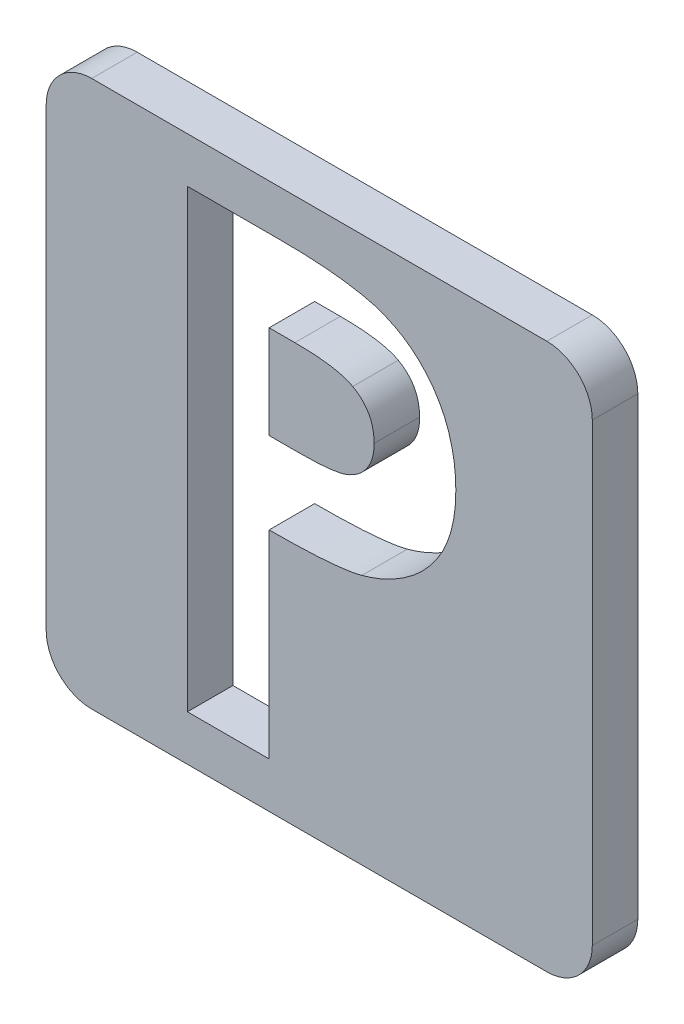
ISO-10303-21;
HEADER;
FILE_DESCRIPTION(('STEP AP214'),'2;1');
FILE_NAME('part.step','',(''),(''),'','','');
FILE_SCHEMA(('AUTOMOTIVE_DESIGN { 1 0 10303 214 1 1 1 1 }'));
ENDSEC;
DATA;
#1=APPLICATION_CONTEXT('core data for automotive mechanical design processes');
#2=APPLICATION_PROTOCOL_DEFINITION('international standard','automotive_design',2000,#1);
#3=PRODUCT_CONTEXT('',#1,'mechanical');
#4=PRODUCT('Part','Part','',(#3));
#5=PRODUCT_RELATED_PRODUCT_CATEGORY('part','',(#4));
#6=PRODUCT_DEFINITION_FORMATION('','',#4);
#7=PRODUCT_DEFINITION_CONTEXT('part definition',#1,'design');
#8=PRODUCT_DEFINITION('design','',#6,#7);
#9=PRODUCT_DEFINITION_SHAPE('','',#8);
#10=(LENGTH_UNIT() NAMED_UNIT(*) SI_UNIT(.MILLI.,.METRE.));
#11=(NAMED_UNIT(*) PLANE_ANGLE_UNIT() SI_UNIT($,.RADIAN.));
#12=(NAMED_UNIT(*) SI_UNIT($,.STERADIAN.) SOLID_ANGLE_UNIT());
#13=UNCERTAINTY_MEASURE_WITH_UNIT(LENGTH_MEASURE(1.E-05),#10,'distance_accuracy_value','');
#14=(GEOMETRIC_REPRESENTATION_CONTEXT(3) GLOBAL_UNCERTAINTY_ASSIGNED_CONTEXT((#13)) GLOBAL_UNIT_ASSIGNED_CONTEXT((#10,
#11,#12)) REPRESENTATION_CONTEXT('',''));
#15=CARTESIAN_POINT('',(0.,0.,0.));
#16=DIRECTION('',(0.,0.,1.));
#17=DIRECTION('',(1.,0.,0.));
#18=AXIS2_PLACEMENT_3D('',#15,#16,#17);
#19=CARTESIAN_POINT('',(50.,50.,10.));
#20=DIRECTION('',(0.,0.,-1.));
#21=DIRECTION('',(-1.,0.,0.));
#22=AXIS2_PLACEMENT_3D('',#19,#20,#21);
#23=PLANE('',#22);
#24=DIRECTION('',(1.,0.,0.));
#25=VECTOR('',#24,1.);
#26=CARTESIAN_POINT('',(-49.9999999999999,60.,10.));
#27=LINE('',#26,#25);
#28=CARTESIAN_POINT('',(-49.9999999999999,60.,10.));
#29=VERTEX_POINT('',#28);
#30=CARTESIAN_POINT('',(49.9999999999999,60.,10.));
#31=VERTEX_POINT('',#30);
#32=EDGE_CURVE('E297',#29,#31,#27,.T.);
#33=ORIENTED_EDGE('',*,*,#32,.F.);
#34=CARTESIAN_POINT('',(-50.,50.,10.));
#35=DIRECTION('',(0.,0.,1.));
#36=DIRECTION('',(1.,0.,0.));
#37=AXIS2_PLACEMENT_3D('',#34,#35,#36);
#38=CIRCLE('',#37,10.);
#39=CARTESIAN_POINT('',(-60.,49.9999999999999,10.));
#40=VERTEX_POINT('',#39);
#41=EDGE_CURVE('E303',#29,#40,#38,.T.);
#42=ORIENTED_EDGE('',*,*,#41,.T.);
#43=DIRECTION('',(0.,-1.,0.));
#44=VECTOR('',#43,1.);
#45=CARTESIAN_POINT('',(-60.,49.9999999999999,10.));
#46=LINE('',#45,#44);
#47=CARTESIAN_POINT('',(-60.,-49.9999999999999,10.));
#48=VERTEX_POINT('',#47);
#49=EDGE_CURVE('E305',#40,#48,#46,.T.);
#50=ORIENTED_EDGE('',*,*,#49,.T.);
#51=CARTESIAN_POINT('',(-50.,-50.,10.));
#52=DIRECTION('',(0.,0.,1.));
#53=DIRECTION('',(1.,0.,0.));
#54=AXIS2_PLACEMENT_3D('',#51,#52,#53);
#55=CIRCLE('',#54,10.);
#56=CARTESIAN_POINT('',(-49.9999999999999,-60.,10.));
#57=VERTEX_POINT('',#56);
#58=EDGE_CURVE('E307',#48,#57,#55,.T.);
#59=ORIENTED_EDGE('',*,*,#58,.T.);
#60=DIRECTION('',(1.,0.,0.));
#61=VECTOR('',#60,1.);
#62=CARTESIAN_POINT('',(-49.9999999999999,-60.,10.));
#63=LINE('',#62,#61);
#64=CARTESIAN_POINT('',(49.9999999999999,-60.,10.));
#65=VERTEX_POINT('',#64);
#66=EDGE_CURVE('E309',#57,#65,#63,.T.);
#67=ORIENTED_EDGE('',*,*,#66,.T.);
#68=CARTESIAN_POINT('',(50.,-50.,10.));
#69=DIRECTION('',(0.,0.,1.));
#70=DIRECTION('',(1.,0.,0.));
#71=AXIS2_PLACEMENT_3D('',#68,#69,#70);
#72=CIRCLE('',#71,10.);
#73=CARTESIAN_POINT('',(60.,-50.,10.));
#74=VERTEX_POINT('',#73);
#75=EDGE_CURVE('E191',#65,#74,#72,.T.);
#76=ORIENTED_EDGE('',*,*,#75,.T.);
#77=DIRECTION('',(0.,-1.,0.));
#78=VECTOR('',#77,1.);
#79=CARTESIAN_POINT('',(60.,49.9999999999999,10.));
#80=LINE('',#79,#78);
#81=CARTESIAN_POINT('',(60.,49.9999999999999,10.));
#82=VERTEX_POINT('',#81);
#83=EDGE_CURVE('E312',#82,#74,#80,.T.);
#84=ORIENTED_EDGE('',*,*,#83,.F.);
#85=CARTESIAN_POINT('',(50.,50.,10.));
#86=DIRECTION('',(0.,0.,-1.));
#87=DIRECTION('',(-1.,0.,0.));
#88=AXIS2_PLACEMENT_3D('',#85,#86,#87);
#89=CIRCLE('',#88,10.);
#90=EDGE_CURVE('E317',#31,#82,#89,.T.);
#91=ORIENTED_EDGE('',*,*,#90,.F.);
#92=EDGE_LOOP('',(#33,#42,#50,#59,#67,#76,#84,#91));
#93=FACE_BOUND('',#92,.T.);
#94=DIRECTION('',(0.,1.,0.));
#95=VECTOR('',#94,1.);
#96=CARTESIAN_POINT('',(-28.9615384615385,-50.,10.));
#97=LINE('',#96,#95);
#98=CARTESIAN_POINT('',(-28.9615384615385,-50.,10.));
#99=VERTEX_POINT('',#98);
#100=CARTESIAN_POINT('',(-28.9615384615385,50.,10.));
#101=VERTEX_POINT('',#100);
#102=EDGE_CURVE('E99',#99,#101,#97,.T.);
#103=ORIENTED_EDGE('',*,*,#102,.T.);
#104=DIRECTION('',(1.,0.,0.));
#105=VECTOR('',#104,1.);
#106=CARTESIAN_POINT('',(-28.9615384615385,50.,10.));
#107=LINE('',#106,#105);
#108=CARTESIAN_POINT('',(-8.92948717948718,50.,10.));
#109=VERTEX_POINT('',#108);
#110=EDGE_CURVE('E89',#101,#109,#107,.T.);
#111=ORIENTED_EDGE('',*,*,#110,.T.);
#112=CARTESIAN_POINT('',(-8.92948717948718,50.,10.));
#113=CARTESIAN_POINT('',(-7.62061893597607,49.994141227155,10.));
#114=CARTESIAN_POINT('',(-5.09553773840617,49.9828384262619,10.));
#115=CARTESIAN_POINT('',(-1.45416290408074,49.8457769305817,10.));
#116=CARTESIAN_POINT('',(1.90518367157898,49.6001543815466,10.));
#117=CARTESIAN_POINT('',(4.98173018478452,49.2966037548797,10.));
#118=CARTESIAN_POINT('',(7.77421163557631,48.8710375874276,10.));
#119=CARTESIAN_POINT('',(10.2861250487435,48.3831592970923,10.));
#120=CARTESIAN_POINT('',(12.5179917062721,47.7887815446204,10.));
#121=CARTESIAN_POINT('',(14.4949792225589,47.0832633905237,10.));
#122=CARTESIAN_POINT('',(16.2692616591532,46.25148505134,10.));
#123=CARTESIAN_POINT('',(17.9483051032826,45.3655817472497,10.));
#124=CARTESIAN_POINT('',(19.4941629875845,44.3082873988221,10.));
#125=CARTESIAN_POINT('',(20.9848594290215,43.1935527010039,10.));
#126=CARTESIAN_POINT('',(22.3351687414743,41.9148874759363,10.));
#127=CARTESIAN_POINT('',(23.6293313036927,40.5573887505258,10.));
#128=CARTESIAN_POINT('',(24.8125358012166,39.0672192413215,10.));
#129=CARTESIAN_POINT('',(25.8902647639301,37.4624170490553,10.));
#130=CARTESIAN_POINT('',(26.8679309986877,35.7726320564372,10.));
#131=CARTESIAN_POINT('',(27.7220856252221,33.9948434289309,10.));
#132=CARTESIAN_POINT('',(28.4149280250458,32.1262380020023,10.));
#133=CARTESIAN_POINT('',(28.9961366474227,30.1789035283388,10.));
#134=CARTESIAN_POINT('',(29.4629690750189,28.1529248770434,10.));
#135=CARTESIAN_POINT('',(29.7737075998739,26.0358420991668,10.));
#136=CARTESIAN_POINT('',(29.9847768383796,23.8424374709891,10.));
#137=CARTESIAN_POINT('',(30.0034007842426,22.349604897386,10.));
#138=CARTESIAN_POINT('',(30.0128205128205,21.5945512820513,10.));
#139=B_SPLINE_CURVE_WITH_KNOTS('',3,(#112,#113,#114,#115,#116,#117,#118,#119,#120,#121,#122,
#123,#124,#125,#126,#127,#128,#129,#130,#131,#132,#133,#134,#135,#136,#137,#138),.UNSPECIFIED.,
.F.,.F.,(4,1,1,1,1,1,1,1,1,1,1,1,1,1,1,1,1,1,1,1,1,1,1,1,4),(0.,0.0707811610050439,
0.136551696232278,0.197012482434324,0.252922694075429,0.303686532040096,0.349719151022807,
0.391240471277197,0.428478555486923,0.463056564891235,0.49715035762271,0.5310023337427,
0.564226376953418,0.597700669524039,0.631421420980903,0.665597346837222,0.7004514363039,
0.735880683980128,0.771092107926128,0.806974845023309,0.843534402844804,0.880940195544432,
0.919294384307275,0.959180240313535,1.),.UNSPECIFIED.);
#140=CARTESIAN_POINT('',(30.0128205128205,21.5945512820513,10.));
#141=VERTEX_POINT('',#140);
#142=EDGE_CURVE('E162',#109,#141,#139,.T.);
#143=ORIENTED_EDGE('',*,*,#142,.T.);
#144=CARTESIAN_POINT('',(30.0128205128205,21.5945512820513,10.));
#145=CARTESIAN_POINT('',(29.9991913449746,20.7592534454812,10.));
#146=CARTESIAN_POINT('',(29.97240835534,19.1177905512306,10.));
#147=CARTESIAN_POINT('',(29.70984874625,16.7116073318748,10.));
#148=CARTESIAN_POINT('',(29.2613139794813,14.4175294853795,10.));
#149=CARTESIAN_POINT('',(28.6751024998785,12.2162106419537,10.));
#150=CARTESIAN_POINT('',(27.8576722812855,10.1438673761004,10.));
#151=CARTESIAN_POINT('',(26.9237966421009,8.15105294155866,10.));
#152=CARTESIAN_POINT('',(25.7748333895482,6.29363973816612,10.));
#153=CARTESIAN_POINT('',(24.4619591939982,4.54839376386164,10.));
#154=CARTESIAN_POINT('',(23.0281507938461,2.90112534481889,10.));
#155=CARTESIAN_POINT('',(21.4393696389824,1.39939624186772,10.));
#156=CARTESIAN_POINT('',(19.7258985822293,0.0329692197277877,10.));
#157=CARTESIAN_POINT('',(17.8976562929788,-1.21247598401826,10.));
#158=CARTESIAN_POINT('',(15.9477790009029,-2.33442702891141,10.));
#159=CARTESIAN_POINT('',(13.8776736391486,-3.3433897944153,10.));
#160=CARTESIAN_POINT('',(11.6732043545179,-4.20709452257594,10.));
#161=CARTESIAN_POINT('',(10.1380782703469,-4.65880510164113,10.));
#162=CARTESIAN_POINT('',(9.35977564102564,-4.88782051282052,10.));
#163=B_SPLINE_CURVE_WITH_KNOTS('',3,(#144,#145,#146,#147,#148,#149,#150,#151,#152,#153,#154,
#155,#156,#157,#158,#159,#160,#161,#162),.UNSPECIFIED.,.F.,.F.,(4,1,1,1,1,1,1,1,1,1,1,1,1,1,1,1,
4),(0.,0.0688754254237469,0.135348674699122,0.19928931521934,0.261550080394498,
0.322915384153855,0.382771997126528,0.4428435721153,0.502652029102514,0.562748843189492,
0.622739581707681,0.682687331514855,0.743329246885999,0.805012514101275,0.868067120359293,
0.933110571061835,1.),.UNSPECIFIED.);
#164=CARTESIAN_POINT('',(9.35977564102564,-4.88782051282052,10.));
#165=VERTEX_POINT('',#164);
#166=EDGE_CURVE('E170',#141,#165,#163,.T.);
#167=ORIENTED_EDGE('',*,*,#166,.T.);
#168=CARTESIAN_POINT('',(9.35977564102564,-4.88782051282052,10.));
#169=CARTESIAN_POINT('',(8.84714075802548,-5.01536490144681,10.));
#170=CARTESIAN_POINT('',(7.73660852314056,-5.29166711896122,10.));
#171=CARTESIAN_POINT('',(5.89898269811195,-5.57218321927008,10.));
#172=CARTESIAN_POINT('',(3.78131187575789,-5.83010052573439,10.));
#173=CARTESIAN_POINT('',(1.37674824226034,-6.05174922698223,10.));
#174=CARTESIAN_POINT('',(-1.31609449117238,-6.20241869696783,10.));
#175=CARTESIAN_POINT('',(-4.29460894870648,-6.32008485221448,10.));
#176=CARTESIAN_POINT('',(-7.5601449459336,-6.40564029850087,10.));
#177=CARTESIAN_POINT('',(-9.83086954606305,-6.40867618134512,10.));
#178=CARTESIAN_POINT('',(-11.0128205128205,-6.41025641025642,10.));
#179=B_SPLINE_CURVE_WITH_KNOTS('',3,(#168,#169,#170,#171,#172,#173,#174,#175,#176,#177,#178),
.UNSPECIFIED.,.F.,.F.,(4,1,1,1,1,1,1,1,4),(0.,0.0773727494946835,0.167614290921154,
0.272108316519902,0.390015992275447,0.521363310208999,0.667272254031791,0.826809521070173,1.),.UNSPECIFIED.);
#180=CARTESIAN_POINT('',(-11.0128205128205,-6.41025641025642,10.));
#181=VERTEX_POINT('',#180);
#182=EDGE_CURVE('E177',#165,#181,#179,.T.);
#183=ORIENTED_EDGE('',*,*,#182,.T.);
#184=DIRECTION('',(0.,-1.,0.));
#185=VECTOR('',#184,1.);
#186=CARTESIAN_POINT('',(-11.0128205128205,-6.41025641025642,10.));
#187=LINE('',#186,#185);
#188=CARTESIAN_POINT('',(-11.0128205128205,-50.,10.));
#189=VERTEX_POINT('',#188);
#190=EDGE_CURVE('E326',#181,#189,#187,.T.);
#191=ORIENTED_EDGE('',*,*,#190,.T.);
#192=DIRECTION('',(-1.,0.,0.));
#193=VECTOR('',#192,1.);
#194=CARTESIAN_POINT('',(-11.0128205128205,-50.,10.));
#195=LINE('',#194,#193);
#196=EDGE_CURVE('E299',#189,#99,#195,.T.);
#197=ORIENTED_EDGE('',*,*,#196,.T.);
#198=EDGE_LOOP('',(#103,#111,#143,#167,#183,#191,#197));
#199=FACE_BOUND('',#198,.T.);
#200=ADVANCED_FACE('F43',(#93,#199),#23,.F.);
#201=CARTESIAN_POINT('',(50.,50.,0.));
#202=DIRECTION('',(0.,0.,-1.));
#203=DIRECTION('',(-1.,0.,0.));
#204=AXIS2_PLACEMENT_3D('',#201,#202,#203);
#205=PLANE('',#204);
#206=DIRECTION('',(1.,0.,0.));
#207=VECTOR('',#206,1.);
#208=CARTESIAN_POINT('',(-49.9999999999999,60.,0.));
#209=LINE('',#208,#207);
#210=CARTESIAN_POINT('',(-49.9999999999999,60.,0.));
#211=VERTEX_POINT('',#210);
#212=CARTESIAN_POINT('',(49.9999999999999,60.,0.));
#213=VERTEX_POINT('',#212);
#214=EDGE_CURVE('E240',#211,#213,#209,.T.);
#215=ORIENTED_EDGE('',*,*,#214,.T.);
#216=CARTESIAN_POINT('',(50.,50.,0.));
#217=DIRECTION('',(0.,0.,-1.));
#218=DIRECTION('',(-1.,0.,0.));
#219=AXIS2_PLACEMENT_3D('',#216,#217,#218);
#220=CIRCLE('',#219,10.);
#221=CARTESIAN_POINT('',(60.,49.9999999999999,0.));
#222=VERTEX_POINT('',#221);
#223=EDGE_CURVE('E288',#213,#222,#220,.T.);
#224=ORIENTED_EDGE('',*,*,#223,.T.);
#225=DIRECTION('',(0.,-1.,0.));
#226=VECTOR('',#225,1.);
#227=CARTESIAN_POINT('',(60.,49.9999999999999,0.));
#228=LINE('',#227,#226);
#229=CARTESIAN_POINT('',(60.,-50.,0.));
#230=VERTEX_POINT('',#229);
#231=EDGE_CURVE('E295',#222,#230,#228,.T.);
#232=ORIENTED_EDGE('',*,*,#231,.T.);
#233=CARTESIAN_POINT('',(50.,-50.,0.));
#234=DIRECTION('',(0.,0.,1.));
#235=DIRECTION('',(1.,0.,0.));
#236=AXIS2_PLACEMENT_3D('',#233,#234,#235);
#237=CIRCLE('',#236,10.);
#238=CARTESIAN_POINT('',(49.9999999999999,-60.,0.));
#239=VERTEX_POINT('',#238);
#240=EDGE_CURVE('E348',#239,#230,#237,.T.);
#241=ORIENTED_EDGE('',*,*,#240,.F.);
#242=DIRECTION('',(1.,0.,0.));
#243=VECTOR('',#242,1.);
#244=CARTESIAN_POINT('',(-49.9999999999999,-60.,0.));
#245=LINE('',#244,#243);
#246=CARTESIAN_POINT('',(-49.9999999999999,-60.,0.));
#247=VERTEX_POINT('',#246);
#248=EDGE_CURVE('E352',#247,#239,#245,.T.);
#249=ORIENTED_EDGE('',*,*,#248,.F.);
#250=CARTESIAN_POINT('',(-50.,-50.,0.));
#251=DIRECTION('',(0.,0.,1.));
#252=DIRECTION('',(1.,0.,0.));
#253=AXIS2_PLACEMENT_3D('',#250,#251,#252);
#254=CIRCLE('',#253,10.);
#255=CARTESIAN_POINT('',(-60.,-49.9999999999999,0.));
#256=VERTEX_POINT('',#255);
#257=EDGE_CURVE('E356',#256,#247,#254,.T.);
#258=ORIENTED_EDGE('',*,*,#257,.F.);
#259=DIRECTION('',(0.,-1.,0.));
#260=VECTOR('',#259,1.);
#261=CARTESIAN_POINT('',(-60.,49.9999999999999,0.));
#262=LINE('',#261,#260);
#263=CARTESIAN_POINT('',(-60.,49.9999999999999,0.));
#264=VERTEX_POINT('',#263);
#265=EDGE_CURVE('E360',#264,#256,#262,.T.);
#266=ORIENTED_EDGE('',*,*,#265,.F.);
#267=CARTESIAN_POINT('',(-50.,50.,0.));
#268=DIRECTION('',(0.,0.,1.));
#269=DIRECTION('',(1.,0.,0.));
#270=AXIS2_PLACEMENT_3D('',#267,#268,#269);
#271=CIRCLE('',#270,10.);
#272=EDGE_CURVE('E339',#211,#264,#271,.T.);
#273=ORIENTED_EDGE('',*,*,#272,.F.);
#274=EDGE_LOOP('',(#215,#224,#232,#241,#249,#258,#266,#273));
#275=FACE_BOUND('',#274,.T.);
#276=DIRECTION('',(1.,0.,0.));
#277=VECTOR('',#276,1.);
#278=CARTESIAN_POINT('',(-28.9615384615385,50.,0.));
#279=LINE('',#278,#277);
#280=CARTESIAN_POINT('',(-28.9615384615385,50.,0.));
#281=VERTEX_POINT('',#280);
#282=CARTESIAN_POINT('',(-8.92948717948718,50.,0.));
#283=VERTEX_POINT('',#282);
#284=EDGE_CURVE('E85',#281,#283,#279,.T.);
#285=ORIENTED_EDGE('',*,*,#284,.F.);
#286=DIRECTION('',(0.,1.,0.));
#287=VECTOR('',#286,1.);
#288=CARTESIAN_POINT('',(-28.9615384615385,-50.,0.));
#289=LINE('',#288,#287);
#290=CARTESIAN_POINT('',(-28.9615384615385,-50.,0.));
#291=VERTEX_POINT('',#290);
#292=EDGE_CURVE('E46',#291,#281,#289,.T.);
#293=ORIENTED_EDGE('',*,*,#292,.F.);
#294=DIRECTION('',(-1.,0.,0.));
#295=VECTOR('',#294,1.);
#296=CARTESIAN_POINT('',(-11.0128205128205,-50.,0.));
#297=LINE('',#296,#295);
#298=CARTESIAN_POINT('',(-11.0128205128205,-50.,0.));
#299=VERTEX_POINT('',#298);
#300=EDGE_CURVE('E52',#299,#291,#297,.T.);
#301=ORIENTED_EDGE('',*,*,#300,.F.);
#302=DIRECTION('',(0.,-1.,0.));
#303=VECTOR('',#302,1.);
#304=CARTESIAN_POINT('',(-11.0128205128205,-6.41025641025642,0.));
#305=LINE('',#304,#303);
#306=CARTESIAN_POINT('',(-11.0128205128205,-6.41025641025642,0.));
#307=VERTEX_POINT('',#306);
#308=EDGE_CURVE('E194',#307,#299,#305,.T.);
#309=ORIENTED_EDGE('',*,*,#308,.F.);
#310=CARTESIAN_POINT('',(9.35977564102564,-4.88782051282052,0.));
#311=CARTESIAN_POINT('',(8.84714075802548,-5.01536490144681,0.));
#312=CARTESIAN_POINT('',(7.73660852314056,-5.29166711896122,0.));
#313=CARTESIAN_POINT('',(5.89898269811195,-5.57218321927008,0.));
#314=CARTESIAN_POINT('',(3.78131187575789,-5.83010052573439,0.));
#315=CARTESIAN_POINT('',(1.37674824226034,-6.05174922698223,0.));
#316=CARTESIAN_POINT('',(-1.31609449117238,-6.20241869696783,0.));
#317=CARTESIAN_POINT('',(-4.29460894870648,-6.32008485221448,0.));
#318=CARTESIAN_POINT('',(-7.5601449459336,-6.40564029850087,0.));
#319=CARTESIAN_POINT('',(-9.83086954606305,-6.40867618134512,0.));
#320=CARTESIAN_POINT('',(-11.0128205128205,-6.41025641025642,0.));
#321=B_SPLINE_CURVE_WITH_KNOTS('',3,(#310,#311,#312,#313,#314,#315,#316,#317,#318,#319,#320),
.UNSPECIFIED.,.F.,.F.,(4,1,1,1,1,1,1,1,4),(0.,0.0773727494946835,0.167614290921154,
0.272108316519902,0.390015992275447,0.521363310208999,0.667272254031791,0.826809521070173,1.),.UNSPECIFIED.);
#322=CARTESIAN_POINT('',(9.35977564102564,-4.88782051282052,0.));
#323=VERTEX_POINT('',#322);
#324=EDGE_CURVE('E198',#323,#307,#321,.T.);
#325=ORIENTED_EDGE('',*,*,#324,.F.);
#326=CARTESIAN_POINT('',(30.0128205128205,21.5945512820513,0.));
#327=CARTESIAN_POINT('',(29.9991913449746,20.7592534454812,0.));
#328=CARTESIAN_POINT('',(29.97240835534,19.1177905512306,0.));
#329=CARTESIAN_POINT('',(29.70984874625,16.7116073318748,0.));
#330=CARTESIAN_POINT('',(29.2613139794813,14.4175294853795,0.));
#331=CARTESIAN_POINT('',(28.6751024998785,12.2162106419537,0.));
#332=CARTESIAN_POINT('',(27.8576722812855,10.1438673761004,0.));
#333=CARTESIAN_POINT('',(26.9237966421009,8.15105294155866,0.));
#334=CARTESIAN_POINT('',(25.7748333895482,6.29363973816612,0.));
#335=CARTESIAN_POINT('',(24.4619591939982,4.54839376386164,0.));
#336=CARTESIAN_POINT('',(23.0281507938461,2.90112534481889,0.));
#337=CARTESIAN_POINT('',(21.4393696389824,1.39939624186772,0.));
#338=CARTESIAN_POINT('',(19.7258985822293,0.0329692197277877,0.));
#339=CARTESIAN_POINT('',(17.8976562929788,-1.21247598401826,0.));
#340=CARTESIAN_POINT('',(15.9477790009029,-2.33442702891141,0.));
#341=CARTESIAN_POINT('',(13.8776736391486,-3.3433897944153,0.));
#342=CARTESIAN_POINT('',(11.6732043545179,-4.20709452257594,0.));
#343=CARTESIAN_POINT('',(10.1380782703469,-4.65880510164113,0.));
#344=CARTESIAN_POINT('',(9.35977564102564,-4.88782051282052,0.));
#345=B_SPLINE_CURVE_WITH_KNOTS('',3,(#326,#327,#328,#329,#330,#331,#332,#333,#334,#335,#336,
#337,#338,#339,#340,#341,#342,#343,#344),.UNSPECIFIED.,.F.,.F.,(4,1,1,1,1,1,1,1,1,1,1,1,1,1,1,1,
4),(0.,0.0688754254237469,0.135348674699122,0.19928931521934,0.261550080394498,
0.322915384153855,0.382771997126528,0.4428435721153,0.502652029102514,0.562748843189492,
0.622739581707681,0.682687331514855,0.743329246885999,0.805012514101275,0.868067120359293,
0.933110571061835,1.),.UNSPECIFIED.);
#346=CARTESIAN_POINT('',(30.0128205128205,21.5945512820513,0.));
#347=VERTEX_POINT('',#346);
#348=EDGE_CURVE('E167',#347,#323,#345,.T.);
#349=ORIENTED_EDGE('',*,*,#348,.F.);
#350=CARTESIAN_POINT('',(-8.92948717948718,50.,0.));
#351=CARTESIAN_POINT('',(-7.62061893597607,49.994141227155,0.));
#352=CARTESIAN_POINT('',(-5.09553773840617,49.9828384262619,0.));
#353=CARTESIAN_POINT('',(-1.45416290408074,49.8457769305817,0.));
#354=CARTESIAN_POINT('',(1.90518367157898,49.6001543815466,0.));
#355=CARTESIAN_POINT('',(4.98173018478452,49.2966037548797,0.));
#356=CARTESIAN_POINT('',(7.77421163557631,48.8710375874276,0.));
#357=CARTESIAN_POINT('',(10.2861250487435,48.3831592970923,0.));
#358=CARTESIAN_POINT('',(12.5179917062721,47.7887815446204,0.));
#359=CARTESIAN_POINT('',(14.4949792225589,47.0832633905237,0.));
#360=CARTESIAN_POINT('',(16.2692616591532,46.25148505134,0.));
#361=CARTESIAN_POINT('',(17.9483051032826,45.3655817472497,0.));
#362=CARTESIAN_POINT('',(19.4941629875845,44.3082873988221,0.));
#363=CARTESIAN_POINT('',(20.9848594290215,43.1935527010039,0.));
#364=CARTESIAN_POINT('',(22.3351687414743,41.9148874759363,0.));
#365=CARTESIAN_POINT('',(23.6293313036927,40.5573887505258,0.));
#366=CARTESIAN_POINT('',(24.8125358012166,39.0672192413215,0.));
#367=CARTESIAN_POINT('',(25.8902647639301,37.4624170490553,0.));
#368=CARTESIAN_POINT('',(26.8679309986877,35.7726320564372,0.));
#369=CARTESIAN_POINT('',(27.7220856252221,33.9948434289309,0.));
#370=CARTESIAN_POINT('',(28.4149280250458,32.1262380020023,0.));
#371=CARTESIAN_POINT('',(28.9961366474227,30.1789035283388,0.));
#372=CARTESIAN_POINT('',(29.4629690750189,28.1529248770434,0.));
#373=CARTESIAN_POINT('',(29.7737075998739,26.0358420991668,0.));
#374=CARTESIAN_POINT('',(29.9847768383796,23.8424374709891,0.));
#375=CARTESIAN_POINT('',(30.0034007842426,22.349604897386,0.));
#376=CARTESIAN_POINT('',(30.0128205128205,21.5945512820513,0.));
#377=B_SPLINE_CURVE_WITH_KNOTS('',3,(#350,#351,#352,#353,#354,#355,#356,#357,#358,#359,#360,
#361,#362,#363,#364,#365,#366,#367,#368,#369,#370,#371,#372,#373,#374,#375,#376),.UNSPECIFIED.,
.F.,.F.,(4,1,1,1,1,1,1,1,1,1,1,1,1,1,1,1,1,1,1,1,1,1,1,1,4),(0.,0.0707811610050439,
0.136551696232278,0.197012482434324,0.252922694075429,0.303686532040096,0.349719151022807,
0.391240471277197,0.428478555486923,0.463056564891235,0.49715035762271,0.5310023337427,
0.564226376953418,0.597700669524039,0.631421420980903,0.665597346837222,0.7004514363039,
0.735880683980128,0.771092107926128,0.806974845023309,0.843534402844804,0.880940195544432,
0.919294384307275,0.959180240313535,1.),.UNSPECIFIED.);
#378=EDGE_CURVE('E164',#283,#347,#377,.T.);
#379=ORIENTED_EDGE('',*,*,#378,.F.);
#380=EDGE_LOOP('',(#285,#293,#301,#309,#325,#349,#379));
#381=FACE_BOUND('',#380,.T.);
#382=ADVANCED_FACE('F223',(#275,#381),#205,.T.);
#383=CARTESIAN_POINT('',(-49.9999999999999,60.,10.));
#384=DIRECTION('',(0.,1.,0.));
#385=DIRECTION('',(0.,0.,1.));
#386=AXIS2_PLACEMENT_3D('',#383,#384,#385);
#387=PLANE('',#386);
#388=ORIENTED_EDGE('',*,*,#214,.F.);
#389=DIRECTION('',(0.,0.,-1.));
#390=VECTOR('',#389,1.);
#391=CARTESIAN_POINT('',(-49.9999999999999,60.,10.));
#392=LINE('',#391,#390);
#393=EDGE_CURVE('E341',#29,#211,#392,.T.);
#394=ORIENTED_EDGE('',*,*,#393,.F.);
#395=ORIENTED_EDGE('',*,*,#32,.T.);
#396=DIRECTION('',(0.,0.,-1.));
#397=VECTOR('',#396,1.);
#398=CARTESIAN_POINT('',(49.9999999999999,60.,10.));
#399=LINE('',#398,#397);
#400=EDGE_CURVE('E290',#31,#213,#399,.T.);
#401=ORIENTED_EDGE('',*,*,#400,.T.);
#402=EDGE_LOOP('',(#388,#394,#395,#401));
#403=FACE_BOUND('',#402,.T.);
#404=ADVANCED_FACE('F225',(#403),#387,.T.);
#405=CARTESIAN_POINT('',(-50.,50.,10.));
#406=DIRECTION('',(0.,0.,-1.));
#407=DIRECTION('',(-1.,0.,0.));
#408=AXIS2_PLACEMENT_3D('',#405,#406,#407);
#409=CYLINDRICAL_SURFACE('',#408,10.);
#410=ORIENTED_EDGE('',*,*,#272,.T.);
#411=DIRECTION('',(0.,0.,-1.));
#412=VECTOR('',#411,1.);
#413=CARTESIAN_POINT('',(-60.,49.9999999999999,10.));
#414=LINE('',#413,#412);
#415=EDGE_CURVE('E357',#40,#264,#414,.T.);
#416=ORIENTED_EDGE('',*,*,#415,.F.);
#417=ORIENTED_EDGE('',*,*,#41,.F.);
#418=ORIENTED_EDGE('',*,*,#393,.T.);
#419=EDGE_LOOP('',(#410,#416,#417,#418));
#420=FACE_BOUND('',#419,.T.);
#421=ADVANCED_FACE('F231',(#420),#409,.T.);
#422=CARTESIAN_POINT('',(-60.,49.9999999999999,10.));
#423=DIRECTION('',(1.,0.,0.));
#424=DIRECTION('',(0.,1.,0.));
#425=AXIS2_PLACEMENT_3D('',#422,#423,#424);
#426=PLANE('',#425);
#427=ORIENTED_EDGE('',*,*,#265,.T.);
#428=DIRECTION('',(0.,0.,-1.));
#429=VECTOR('',#428,1.);
#430=CARTESIAN_POINT('',(-60.,-49.9999999999999,10.));
#431=LINE('',#430,#429);
#432=EDGE_CURVE('E353',#48,#256,#431,.T.);
#433=ORIENTED_EDGE('',*,*,#432,.F.);
#434=ORIENTED_EDGE('',*,*,#49,.F.);
#435=ORIENTED_EDGE('',*,*,#415,.T.);
#436=EDGE_LOOP('',(#427,#433,#434,#435));
#437=FACE_BOUND('',#436,.T.);
#438=ADVANCED_FACE('F262',(#437),#426,.F.);
#439=CARTESIAN_POINT('',(-50.,-50.,10.));
#440=DIRECTION('',(0.,0.,-1.));
#441=DIRECTION('',(-1.,0.,0.));
#442=AXIS2_PLACEMENT_3D('',#439,#440,#441);
#443=CYLINDRICAL_SURFACE('',#442,10.);
#444=ORIENTED_EDGE('',*,*,#257,.T.);
#445=DIRECTION('',(0.,0.,-1.));
#446=VECTOR('',#445,1.);
#447=CARTESIAN_POINT('',(-49.9999999999999,-60.,10.));
#448=LINE('',#447,#446);
#449=EDGE_CURVE('E349',#57,#247,#448,.T.);
#450=ORIENTED_EDGE('',*,*,#449,.F.);
#451=ORIENTED_EDGE('',*,*,#58,.F.);
#452=ORIENTED_EDGE('',*,*,#432,.T.);
#453=EDGE_LOOP('',(#444,#450,#451,#452));
#454=FACE_BOUND('',#453,.T.);
#455=ADVANCED_FACE('F266',(#454),#443,.T.);
#456=CARTESIAN_POINT('',(-49.9999999999999,-60.,10.));
#457=DIRECTION('',(0.,1.,0.));
#458=DIRECTION('',(0.,0.,1.));
#459=AXIS2_PLACEMENT_3D('',#456,#457,#458);
#460=PLANE('',#459);
#461=ORIENTED_EDGE('',*,*,#248,.T.);
#462=DIRECTION('',(0.,0.,-1.));
#463=VECTOR('',#462,1.);
#464=CARTESIAN_POINT('',(49.9999999999999,-60.,10.));
#465=LINE('',#464,#463);
#466=EDGE_CURVE('E316',#65,#239,#465,.T.);
#467=ORIENTED_EDGE('',*,*,#466,.F.);
#468=ORIENTED_EDGE('',*,*,#66,.F.);
#469=ORIENTED_EDGE('',*,*,#449,.T.);
#470=EDGE_LOOP('',(#461,#467,#468,#469));
#471=FACE_BOUND('',#470,.T.);
#472=ADVANCED_FACE('F270',(#471),#460,.F.);
#473=CARTESIAN_POINT('',(50.,-50.,10.));
#474=DIRECTION('',(0.,0.,-1.));
#475=DIRECTION('',(-1.,0.,0.));
#476=AXIS2_PLACEMENT_3D('',#473,#474,#475);
#477=CYLINDRICAL_SURFACE('',#476,10.);
#478=ORIENTED_EDGE('',*,*,#240,.T.);
#479=DIRECTION('',(0.,0.,-1.));
#480=VECTOR('',#479,1.);
#481=CARTESIAN_POINT('',(60.,-50.,10.));
#482=LINE('',#481,#480);
#483=EDGE_CURVE('E315',#74,#230,#482,.T.);
#484=ORIENTED_EDGE('',*,*,#483,.F.);
#485=ORIENTED_EDGE('',*,*,#75,.F.);
#486=ORIENTED_EDGE('',*,*,#466,.T.);
#487=EDGE_LOOP('',(#478,#484,#485,#486));
#488=FACE_BOUND('',#487,.T.);
#489=ADVANCED_FACE('F274',(#488),#477,.T.);
#490=CARTESIAN_POINT('',(60.,49.9999999999999,10.));
#491=DIRECTION('',(1.,0.,0.));
#492=DIRECTION('',(0.,1.,0.));
#493=AXIS2_PLACEMENT_3D('',#490,#491,#492);
#494=PLANE('',#493);
#495=ORIENTED_EDGE('',*,*,#231,.F.);
#496=DIRECTION('',(0.,0.,-1.));
#497=VECTOR('',#496,1.);
#498=CARTESIAN_POINT('',(60.,49.9999999999999,10.));
#499=LINE('',#498,#497);
#500=EDGE_CURVE('E292',#82,#222,#499,.T.);
#501=ORIENTED_EDGE('',*,*,#500,.F.);
#502=ORIENTED_EDGE('',*,*,#83,.T.);
#503=ORIENTED_EDGE('',*,*,#483,.T.);
#504=EDGE_LOOP('',(#495,#501,#502,#503));
#505=FACE_BOUND('',#504,.T.);
#506=ADVANCED_FACE('F278',(#505),#494,.T.);
#507=CARTESIAN_POINT('',(50.,50.,10.));
#508=DIRECTION('',(0.,0.,-1.));
#509=DIRECTION('',(-1.,0.,0.));
#510=AXIS2_PLACEMENT_3D('',#507,#508,#509);
#511=CYLINDRICAL_SURFACE('',#510,10.);
#512=ORIENTED_EDGE('',*,*,#223,.F.);
#513=ORIENTED_EDGE('',*,*,#400,.F.);
#514=ORIENTED_EDGE('',*,*,#90,.T.);
#515=ORIENTED_EDGE('',*,*,#500,.T.);
#516=EDGE_LOOP('',(#512,#513,#514,#515));
#517=FACE_BOUND('',#516,.T.);
#518=ADVANCED_FACE('F259',(#517),#511,.T.);
#519=CARTESIAN_POINT('',(-28.9615384615385,-50.,0.));
#520=DIRECTION('',(1.,0.,0.));
#521=DIRECTION('',(0.,0.,-1.));
#522=AXIS2_PLACEMENT_3D('',#519,#520,#521);
#523=PLANE('',#522);
#524=ORIENTED_EDGE('',*,*,#102,.F.);
#525=DIRECTION('',(0.,0.,1.));
#526=VECTOR('',#525,1.);
#527=CARTESIAN_POINT('',(-28.9615384615385,-50.,0.));
#528=LINE('',#527,#526);
#529=EDGE_CURVE('E12',#291,#99,#528,.T.);
#530=ORIENTED_EDGE('',*,*,#529,.F.);
#531=ORIENTED_EDGE('',*,*,#292,.T.);
#532=DIRECTION('',(0.,0.,1.));
#533=VECTOR('',#532,1.);
#534=CARTESIAN_POINT('',(-28.9615384615385,50.,0.));
#535=LINE('',#534,#533);
#536=EDGE_CURVE('E242',#281,#101,#535,.T.);
#537=ORIENTED_EDGE('',*,*,#536,.T.);
#538=EDGE_LOOP('',(#524,#530,#531,#537));
#539=FACE_BOUND('',#538,.T.);
#540=ADVANCED_FACE('F256',(#539),#523,.T.);
#541=CARTESIAN_POINT('',(-28.9615384615385,50.,0.));
#542=DIRECTION('',(0.,-1.,0.));
#543=DIRECTION('',(0.,0.,-1.));
#544=AXIS2_PLACEMENT_3D('',#541,#542,#543);
#545=PLANE('',#544);
#546=ORIENTED_EDGE('',*,*,#110,.F.);
#547=ORIENTED_EDGE('',*,*,#536,.F.);
#548=ORIENTED_EDGE('',*,*,#284,.T.);
#549=DIRECTION('',(0.,0.,1.));
#550=VECTOR('',#549,1.);
#551=CARTESIAN_POINT('',(-8.92948717948718,50.,0.));
#552=LINE('',#551,#550);
#553=EDGE_CURVE('E241',#283,#109,#552,.T.);
#554=ORIENTED_EDGE('',*,*,#553,.T.);
#555=EDGE_LOOP('',(#546,#547,#548,#554));
#556=FACE_BOUND('',#555,.T.);
#557=ADVANCED_FACE('F253',(#556),#545,.T.);
#558=DIRECTION('',(0.,0.,1.));
#559=VECTOR('',#558,1.);
#560=SURFACE_OF_LINEAR_EXTRUSION('',#377,#559);
#561=ORIENTED_EDGE('',*,*,#142,.F.);
#562=ORIENTED_EDGE('',*,*,#553,.F.);
#563=ORIENTED_EDGE('',*,*,#378,.T.);
#564=DIRECTION('',(0.,0.,1.));
#565=VECTOR('',#564,1.);
#566=CARTESIAN_POINT('',(30.0128205128205,21.5945512820513,0.));
#567=LINE('',#566,#565);
#568=EDGE_CURVE('E158',#347,#141,#567,.T.);
#569=ORIENTED_EDGE('',*,*,#568,.T.);
#570=EDGE_LOOP('',(#561,#562,#563,#569));
#571=FACE_BOUND('',#570,.T.);
#572=ADVANCED_FACE('F160',(#571),#560,.T.);
#573=DIRECTION('',(0.,0.,1.));
#574=VECTOR('',#573,1.);
#575=SURFACE_OF_LINEAR_EXTRUSION('',#345,#574);
#576=ORIENTED_EDGE('',*,*,#166,.F.);
#577=ORIENTED_EDGE('',*,*,#568,.F.);
#578=ORIENTED_EDGE('',*,*,#348,.T.);
#579=DIRECTION('',(0.,0.,1.));
#580=VECTOR('',#579,1.);
#581=CARTESIAN_POINT('',(9.35977564102564,-4.88782051282052,0.));
#582=LINE('',#581,#580);
#583=EDGE_CURVE('E173',#323,#165,#582,.T.);
#584=ORIENTED_EDGE('',*,*,#583,.T.);
#585=EDGE_LOOP('',(#576,#577,#578,#584));
#586=FACE_BOUND('',#585,.T.);
#587=ADVANCED_FACE('F171',(#586),#575,.T.);
#588=DIRECTION('',(0.,0.,1.));
#589=VECTOR('',#588,1.);
#590=SURFACE_OF_LINEAR_EXTRUSION('',#321,#589);
#591=ORIENTED_EDGE('',*,*,#182,.F.);
#592=ORIENTED_EDGE('',*,*,#583,.F.);
#593=ORIENTED_EDGE('',*,*,#324,.T.);
#594=DIRECTION('',(0.,0.,1.));
#595=VECTOR('',#594,1.);
#596=CARTESIAN_POINT('',(-11.0128205128205,-6.41025641025642,0.));
#597=LINE('',#596,#595);
#598=EDGE_CURVE('E197',#307,#181,#597,.T.);
#599=ORIENTED_EDGE('',*,*,#598,.T.);
#600=EDGE_LOOP('',(#591,#592,#593,#599));
#601=FACE_BOUND('',#600,.T.);
#602=ADVANCED_FACE('F211',(#601),#590,.T.);
#603=CARTESIAN_POINT('',(-11.0128205128205,-6.41025641025642,0.));
#604=DIRECTION('',(-1.,0.,0.));
#605=DIRECTION('',(0.,0.,1.));
#606=AXIS2_PLACEMENT_3D('',#603,#604,#605);
#607=PLANE('',#606);
#608=ORIENTED_EDGE('',*,*,#190,.F.);
#609=ORIENTED_EDGE('',*,*,#598,.F.);
#610=ORIENTED_EDGE('',*,*,#308,.T.);
#611=DIRECTION('',(0.,0.,1.));
#612=VECTOR('',#611,1.);
#613=CARTESIAN_POINT('',(-11.0128205128205,-50.,0.));
#614=LINE('',#613,#612);
#615=EDGE_CURVE('E193',#299,#189,#614,.T.);
#616=ORIENTED_EDGE('',*,*,#615,.T.);
#617=EDGE_LOOP('',(#608,#609,#610,#616));
#618=FACE_BOUND('',#617,.T.);
#619=ADVANCED_FACE('F215',(#618),#607,.T.);
#620=CARTESIAN_POINT('',(-11.0128205128205,-50.,0.));
#621=DIRECTION('',(0.,1.,0.));
#622=DIRECTION('',(0.,0.,1.));
#623=AXIS2_PLACEMENT_3D('',#620,#621,#622);
#624=PLANE('',#623);
#625=ORIENTED_EDGE('',*,*,#196,.F.);
#626=ORIENTED_EDGE('',*,*,#615,.F.);
#627=ORIENTED_EDGE('',*,*,#300,.T.);
#628=ORIENTED_EDGE('',*,*,#529,.T.);
#629=EDGE_LOOP('',(#625,#626,#627,#628));
#630=FACE_BOUND('',#629,.T.);
#631=ADVANCED_FACE('F220',(#630),#624,.T.);
#632=CLOSED_SHELL('',(#200,#382,#404,#421,#438,#455,#472,#489,#506,#518,#540,#557,#572,#587,
#602,#619,#631));
#633=MANIFOLD_SOLID_BREP('B2',#632);
#634=CARTESIAN_POINT('',(50.,50.,0.));
#635=DIRECTION('',(0.,0.,-1.));
#636=DIRECTION('',(-1.,0.,0.));
#637=AXIS2_PLACEMENT_3D('',#634,#635,#636);
#638=PLANE('',#637);
#639=DIRECTION('',(1.,0.,0.));
#640=VECTOR('',#639,1.);
#641=CARTESIAN_POINT('',(-11.0128205128205,11.5384615384615,0.));
#642=LINE('',#641,#640);
#643=CARTESIAN_POINT('',(-11.0128205128205,11.5384615384615,0.));
#644=VERTEX_POINT('',#643);
#645=CARTESIAN_POINT('',(-4.66266025641026,11.5384615384615,0.));
#646=VERTEX_POINT('',#645);
#647=EDGE_CURVE('E558',#644,#646,#642,.T.);
#648=ORIENTED_EDGE('',*,*,#647,.F.);
#649=DIRECTION('',(0.,-1.,0.));
#650=VECTOR('',#649,1.);
#651=CARTESIAN_POINT('',(-11.0128205128205,32.0512820512821,0.));
#652=LINE('',#651,#650);
#653=CARTESIAN_POINT('',(-11.0128205128205,32.0512820512821,0.));
#654=VERTEX_POINT('',#653);
#655=EDGE_CURVE('E512',#654,#644,#652,.T.);
#656=ORIENTED_EDGE('',*,*,#655,.F.);
#657=DIRECTION('',(-1.,0.,0.));
#658=VECTOR('',#657,1.);
#659=CARTESIAN_POINT('',(-5.36378205128205,32.0512820512821,0.));
#660=LINE('',#659,#658);
#661=CARTESIAN_POINT('',(-5.36378205128205,32.0512820512821,0.));
#662=VERTEX_POINT('',#661);
#663=EDGE_CURVE('E564',#662,#654,#660,.T.);
#664=ORIENTED_EDGE('',*,*,#663,.F.);
#665=CARTESIAN_POINT('',(7.35657051282051,30.068108974359,0.));
#666=CARTESIAN_POINT('',(7.03911927048065,30.2286531706032,0.));
#667=CARTESIAN_POINT('',(6.3670099372684,30.5685581333102,0.));
#668=CARTESIAN_POINT('',(5.22234258072572,30.9637225049753,0.));
#669=CARTESIAN_POINT('',(3.90141393094435,31.2970871837229,0.));
#670=CARTESIAN_POINT('',(2.39530623045473,31.5737766485475,0.));
#671=CARTESIAN_POINT('',(0.710027776579799,31.788516407988,0.));
#672=CARTESIAN_POINT('',(-1.15412075058791,31.9527386038358,0.));
#673=CARTESIAN_POINT('',(-3.19988261954262,32.0187787455136,0.));
#674=CARTESIAN_POINT('',(-4.62258759193149,32.0401487842768,0.));
#675=CARTESIAN_POINT('',(-5.36378205128205,32.0512820512821,0.));
#676=B_SPLINE_CURVE_WITH_KNOTS('',3,(#665,#666,#667,#668,#669,#670,#671,#672,#673,#674,#675),
.UNSPECIFIED.,.F.,.F.,(4,1,1,1,1,1,1,1,4),(0.,0.0821011604414446,0.173824981101113,
0.278953093715719,0.396639095345599,0.527315591589062,0.671298143082037,0.828754379963436,1.),.UNSPECIFIED.);
#677=CARTESIAN_POINT('',(7.35657051282051,30.068108974359,0.));
#678=VERTEX_POINT('',#677);
#679=EDGE_CURVE('E562',#678,#662,#676,.T.);
#680=ORIENTED_EDGE('',*,*,#679,.F.);
#681=CARTESIAN_POINT('',(12.0641025641026,21.6145833333333,0.));
#682=CARTESIAN_POINT('',(12.0483202771287,22.0829468066599,0.));
#683=CARTESIAN_POINT('',(12.0176988457915,22.9916845556981,0.));
#684=CARTESIAN_POINT('',(11.7927454728238,24.3032185296499,0.));
#685=CARTESIAN_POINT('',(11.4342345064304,25.5258387505813,0.));
#686=CARTESIAN_POINT('',(10.9147658978404,26.6467765689785,0.));
#687=CARTESIAN_POINT('',(10.2432159908833,27.6641273325567,0.));
#688=CARTESIAN_POINT('',(9.42446075560307,28.5774902714099,0.));
#689=CARTESIAN_POINT('',(8.46900642899609,29.4064258247642,0.));
#690=CARTESIAN_POINT('',(7.73133982717204,29.8451940750054,0.));
#691=CARTESIAN_POINT('',(7.35657051282051,30.068108974359,0.));
#692=B_SPLINE_CURVE_WITH_KNOTS('',3,(#681,#682,#683,#684,#685,#686,#687,#688,#689,#690,#691),
.UNSPECIFIED.,.F.,.F.,(4,1,1,1,1,1,1,1,4),(0.,0.137787684851013,0.267341237537914,
0.390444330669074,0.511777882758099,0.629508980948092,0.747829065517734,0.871885309729875,1.),.UNSPECIFIED.);
#693=CARTESIAN_POINT('',(12.0641025641026,21.6145833333333,0.));
#694=VERTEX_POINT('',#693);
#695=EDGE_CURVE('E545',#694,#678,#692,.T.);
#696=ORIENTED_EDGE('',*,*,#695,.F.);
#697=CARTESIAN_POINT('',(-4.66266025641026,11.5384615384615,0.));
#698=CARTESIAN_POINT('',(-3.50714834313828,11.5457883808234,0.));
#699=CARTESIAN_POINT('',(-1.38098925646976,11.5592698796165,0.));
#700=CARTESIAN_POINT('',(1.52259324060996,11.7542201897698,0.));
#701=CARTESIAN_POINT('',(3.85596798687575,12.0519486914365,0.));
#702=CARTESIAN_POINT('',(5.69937736722783,12.4789602167462,0.));
#703=CARTESIAN_POINT('',(7.15492367426844,13.1270067492683,0.));
#704=CARTESIAN_POINT('',(8.41024123704795,13.8766745532083,0.));
#705=CARTESIAN_POINT('',(9.48695915840371,14.8246089118258,0.));
#706=CARTESIAN_POINT('',(10.4192384017195,15.9077861125561,0.));
#707=CARTESIAN_POINT('',(11.1645675604296,17.1524110061276,0.));
#708=CARTESIAN_POINT('',(11.6814145113342,18.5382172918953,0.));
#709=CARTESIAN_POINT('',(12.0171481288676,20.0360876961036,0.));
#710=CARTESIAN_POINT('',(12.0481562471738,21.0785063562401,0.));
#711=CARTESIAN_POINT('',(12.0641025641026,21.6145833333333,0.));
#712=B_SPLINE_CURVE_WITH_KNOTS('',3,(#697,#698,#699,#700,#701,#702,#703,#704,#705,#706,#707,
#708,#709,#710,#711),.UNSPECIFIED.,.F.,.F.,(4,1,1,1,1,1,1,1,1,1,1,1,4),(0.,0.155159591661386,
0.285495953702889,0.39050280552986,0.47097504462624,0.538445526733744,0.603655340394174,
0.666587169315626,0.730198949886482,0.794944674902974,0.860228436589803,0.928120706140547,1.),.UNSPECIFIED.);
#713=EDGE_CURVE('E553',#646,#694,#712,.T.);
#714=ORIENTED_EDGE('',*,*,#713,.F.);
#715=EDGE_LOOP('',(#648,#656,#664,#680,#696,#714));
#716=FACE_BOUND('',#715,.T.);
#717=ADVANCED_FACE('F488',(#716),#638,.T.);
#718=CARTESIAN_POINT('',(-11.0128205128205,11.5384615384615,0.));
#719=DIRECTION('',(0.,-1.,0.));
#720=DIRECTION('',(0.,0.,-1.));
#721=AXIS2_PLACEMENT_3D('',#718,#719,#720);
#722=PLANE('',#721);
#723=DIRECTION('',(1.,0.,0.));
#724=VECTOR('',#723,1.);
#725=CARTESIAN_POINT('',(-11.0128205128205,11.5384615384615,10.));
#726=LINE('',#725,#724);
#727=CARTESIAN_POINT('',(-11.0128205128205,11.5384615384615,10.));
#728=VERTEX_POINT('',#727);
#729=CARTESIAN_POINT('',(-4.66266025641026,11.5384615384615,10.));
#730=VERTEX_POINT('',#729);
#731=EDGE_CURVE('E678',#728,#730,#726,.T.);
#732=ORIENTED_EDGE('',*,*,#731,.F.);
#733=DIRECTION('',(0.,0.,1.));
#734=VECTOR('',#733,1.);
#735=CARTESIAN_POINT('',(-11.0128205128205,11.5384615384615,0.));
#736=LINE('',#735,#734);
#737=EDGE_CURVE('E491',#644,#728,#736,.T.);
#738=ORIENTED_EDGE('',*,*,#737,.F.);
#739=ORIENTED_EDGE('',*,*,#647,.T.);
#740=DIRECTION('',(0.,0.,1.));
#741=VECTOR('',#740,1.);
#742=CARTESIAN_POINT('',(-4.66266025641026,11.5384615384615,0.));
#743=LINE('',#742,#741);
#744=EDGE_CURVE('E550',#646,#730,#743,.T.);
#745=ORIENTED_EDGE('',*,*,#744,.T.);
#746=EDGE_LOOP('',(#732,#738,#739,#745));
#747=FACE_BOUND('',#746,.T.);
#748=ADVANCED_FACE('F588',(#747),#722,.T.);
#749=DIRECTION('',(0.,0.,1.));
#750=VECTOR('',#749,1.);
#751=SURFACE_OF_LINEAR_EXTRUSION('',#712,#750);
#752=CARTESIAN_POINT('',(-4.66266025641026,11.5384615384615,10.));
#753=CARTESIAN_POINT('',(-3.50714834313828,11.5457883808234,10.));
#754=CARTESIAN_POINT('',(-1.38098925646976,11.5592698796165,10.));
#755=CARTESIAN_POINT('',(1.52259324060996,11.7542201897698,10.));
#756=CARTESIAN_POINT('',(3.85596798687575,12.0519486914365,10.));
#757=CARTESIAN_POINT('',(5.69937736722783,12.4789602167462,10.));
#758=CARTESIAN_POINT('',(7.15492367426844,13.1270067492683,10.));
#759=CARTESIAN_POINT('',(8.41024123704795,13.8766745532083,10.));
#760=CARTESIAN_POINT('',(9.48695915840371,14.8246089118258,10.));
#761=CARTESIAN_POINT('',(10.4192384017195,15.9077861125561,10.));
#762=CARTESIAN_POINT('',(11.1645675604296,17.1524110061276,10.));
#763=CARTESIAN_POINT('',(11.6814145113342,18.5382172918953,10.));
#764=CARTESIAN_POINT('',(12.0171481288676,20.0360876961036,10.));
#765=CARTESIAN_POINT('',(12.0481562471738,21.0785063562401,10.));
#766=CARTESIAN_POINT('',(12.0641025641026,21.6145833333333,10.));
#767=B_SPLINE_CURVE_WITH_KNOTS('',3,(#752,#753,#754,#755,#756,#757,#758,#759,#760,#761,#762,
#763,#764,#765,#766),.UNSPECIFIED.,.F.,.F.,(4,1,1,1,1,1,1,1,1,1,1,1,4),(0.,0.155159591661386,
0.285495953702889,0.39050280552986,0.47097504462624,0.538445526733744,0.603655340394174,
0.666587169315626,0.730198949886482,0.794944674902974,0.860228436589803,0.928120706140547,1.),.UNSPECIFIED.);
#768=CARTESIAN_POINT('',(12.0641025641026,21.6145833333333,10.));
#769=VERTEX_POINT('',#768);
#770=EDGE_CURVE('E504',#730,#769,#767,.T.);
#771=ORIENTED_EDGE('',*,*,#770,.F.);
#772=ORIENTED_EDGE('',*,*,#744,.F.);
#773=ORIENTED_EDGE('',*,*,#713,.T.);
#774=DIRECTION('',(0.,0.,1.));
#775=VECTOR('',#774,1.);
#776=CARTESIAN_POINT('',(12.0641025641026,21.6145833333333,0.));
#777=LINE('',#776,#775);
#778=EDGE_CURVE('E541',#694,#769,#777,.T.);
#779=ORIENTED_EDGE('',*,*,#778,.T.);
#780=EDGE_LOOP('',(#771,#772,#773,#779));
#781=FACE_BOUND('',#780,.T.);
#782=ADVANCED_FACE('F554',(#781),#751,.T.);
#783=DIRECTION('',(0.,0.,1.));
#784=VECTOR('',#783,1.);
#785=SURFACE_OF_LINEAR_EXTRUSION('',#692,#784);
#786=CARTESIAN_POINT('',(12.0641025641026,21.6145833333333,10.));
#787=CARTESIAN_POINT('',(12.0483202771287,22.0829468066599,10.));
#788=CARTESIAN_POINT('',(12.0176988457915,22.9916845556981,10.));
#789=CARTESIAN_POINT('',(11.7927454728238,24.3032185296499,10.));
#790=CARTESIAN_POINT('',(11.4342345064304,25.5258387505813,10.));
#791=CARTESIAN_POINT('',(10.9147658978404,26.6467765689785,10.));
#792=CARTESIAN_POINT('',(10.2432159908833,27.6641273325567,10.));
#793=CARTESIAN_POINT('',(9.42446075560307,28.5774902714099,10.));
#794=CARTESIAN_POINT('',(8.46900642899609,29.4064258247642,10.));
#795=CARTESIAN_POINT('',(7.73133982717204,29.8451940750054,10.));
#796=CARTESIAN_POINT('',(7.35657051282051,30.068108974359,10.));
#797=B_SPLINE_CURVE_WITH_KNOTS('',3,(#786,#787,#788,#789,#790,#791,#792,#793,#794,#795,#796),
.UNSPECIFIED.,.F.,.F.,(4,1,1,1,1,1,1,1,4),(0.,0.137787684851013,0.267341237537914,
0.390444330669074,0.511777882758099,0.629508980948092,0.747829065517734,0.871885309729875,1.),.UNSPECIFIED.);
#798=CARTESIAN_POINT('',(7.35657051282051,30.068108974359,10.));
#799=VERTEX_POINT('',#798);
#800=EDGE_CURVE('E548',#769,#799,#797,.T.);
#801=ORIENTED_EDGE('',*,*,#800,.F.);
#802=ORIENTED_EDGE('',*,*,#778,.F.);
#803=ORIENTED_EDGE('',*,*,#695,.T.);
#804=DIRECTION('',(0.,0.,1.));
#805=VECTOR('',#804,1.);
#806=CARTESIAN_POINT('',(7.35657051282051,30.068108974359,0.));
#807=LINE('',#806,#805);
#808=EDGE_CURVE('E549',#678,#799,#807,.T.);
#809=ORIENTED_EDGE('',*,*,#808,.T.);
#810=EDGE_LOOP('',(#801,#802,#803,#809));
#811=FACE_BOUND('',#810,.T.);
#812=ADVANCED_FACE('F543',(#811),#785,.T.);
#813=DIRECTION('',(0.,0.,1.));
#814=VECTOR('',#813,1.);
#815=SURFACE_OF_LINEAR_EXTRUSION('',#676,#814);
#816=CARTESIAN_POINT('',(7.35657051282051,30.068108974359,10.));
#817=CARTESIAN_POINT('',(7.03911927048065,30.2286531706032,10.));
#818=CARTESIAN_POINT('',(6.3670099372684,30.5685581333102,10.));
#819=CARTESIAN_POINT('',(5.22234258072572,30.9637225049753,10.));
#820=CARTESIAN_POINT('',(3.90141393094435,31.2970871837229,10.));
#821=CARTESIAN_POINT('',(2.39530623045473,31.5737766485475,10.));
#822=CARTESIAN_POINT('',(0.710027776579799,31.788516407988,10.));
#823=CARTESIAN_POINT('',(-1.15412075058791,31.9527386038358,10.));
#824=CARTESIAN_POINT('',(-3.19988261954262,32.0187787455136,10.));
#825=CARTESIAN_POINT('',(-4.62258759193149,32.0401487842768,10.));
#826=CARTESIAN_POINT('',(-5.36378205128205,32.0512820512821,10.));
#827=B_SPLINE_CURVE_WITH_KNOTS('',3,(#816,#817,#818,#819,#820,#821,#822,#823,#824,#825,#826),
.UNSPECIFIED.,.F.,.F.,(4,1,1,1,1,1,1,1,4),(0.,0.0821011604414446,0.173824981101113,
0.278953093715719,0.396639095345599,0.527315591589062,0.671298143082037,0.828754379963436,1.),.UNSPECIFIED.);
#828=CARTESIAN_POINT('',(-5.36378205128205,32.0512820512821,10.));
#829=VERTEX_POINT('',#828);
#830=EDGE_CURVE('E658',#799,#829,#827,.T.);
#831=ORIENTED_EDGE('',*,*,#830,.F.);
#832=ORIENTED_EDGE('',*,*,#808,.F.);
#833=ORIENTED_EDGE('',*,*,#679,.T.);
#834=DIRECTION('',(0.,0.,1.));
#835=VECTOR('',#834,1.);
#836=CARTESIAN_POINT('',(-5.36378205128205,32.0512820512821,0.));
#837=LINE('',#836,#835);
#838=EDGE_CURVE('E496',#662,#829,#837,.T.);
#839=ORIENTED_EDGE('',*,*,#838,.T.);
#840=EDGE_LOOP('',(#831,#832,#833,#839));
#841=FACE_BOUND('',#840,.T.);
#842=ADVANCED_FACE('F584',(#841),#815,.T.);
#843=CARTESIAN_POINT('',(-5.36378205128205,32.0512820512821,0.));
#844=DIRECTION('',(0.,1.,0.));
#845=DIRECTION('',(0.,0.,1.));
#846=AXIS2_PLACEMENT_3D('',#843,#844,#845);
#847=PLANE('',#846);
#848=DIRECTION('',(-1.,0.,0.));
#849=VECTOR('',#848,1.);
#850=CARTESIAN_POINT('',(-5.36378205128205,32.0512820512821,10.));
#851=LINE('',#850,#849);
#852=CARTESIAN_POINT('',(-11.0128205128205,32.0512820512821,10.));
#853=VERTEX_POINT('',#852);
#854=EDGE_CURVE('E654',#829,#853,#851,.T.);
#855=ORIENTED_EDGE('',*,*,#854,.F.);
#856=ORIENTED_EDGE('',*,*,#838,.F.);
#857=ORIENTED_EDGE('',*,*,#663,.T.);
#858=DIRECTION('',(0.,0.,1.));
#859=VECTOR('',#858,1.);
#860=CARTESIAN_POINT('',(-11.0128205128205,32.0512820512821,0.));
#861=LINE('',#860,#859);
#862=EDGE_CURVE('E41',#654,#853,#861,.T.);
#863=ORIENTED_EDGE('',*,*,#862,.T.);
#864=EDGE_LOOP('',(#855,#856,#857,#863));
#865=FACE_BOUND('',#864,.T.);
#866=ADVANCED_FACE('F595',(#865),#847,.T.);
#867=CARTESIAN_POINT('',(-11.0128205128205,32.0512820512821,0.));
#868=DIRECTION('',(-1.,0.,0.));
#869=DIRECTION('',(0.,0.,1.));
#870=AXIS2_PLACEMENT_3D('',#867,#868,#869);
#871=PLANE('',#870);
#872=DIRECTION('',(0.,-1.,0.));
#873=VECTOR('',#872,1.);
#874=CARTESIAN_POINT('',(-11.0128205128205,32.0512820512821,10.));
#875=LINE('',#874,#873);
#876=EDGE_CURVE('E676',#853,#728,#875,.T.);
#877=ORIENTED_EDGE('',*,*,#876,.F.);
#878=ORIENTED_EDGE('',*,*,#862,.F.);
#879=ORIENTED_EDGE('',*,*,#655,.T.);
#880=ORIENTED_EDGE('',*,*,#737,.T.);
#881=EDGE_LOOP('',(#877,#878,#879,#880));
#882=FACE_BOUND('',#881,.T.);
#883=ADVANCED_FACE('F592',(#882),#871,.T.);
#884=CARTESIAN_POINT('',(50.,50.,10.));
#885=DIRECTION('',(0.,0.,-1.));
#886=DIRECTION('',(-1.,0.,0.));
#887=AXIS2_PLACEMENT_3D('',#884,#885,#886);
#888=PLANE('',#887);
#889=ORIENTED_EDGE('',*,*,#876,.T.);
#890=ORIENTED_EDGE('',*,*,#731,.T.);
#891=ORIENTED_EDGE('',*,*,#770,.T.);
#892=ORIENTED_EDGE('',*,*,#800,.T.);
#893=ORIENTED_EDGE('',*,*,#830,.T.);
#894=ORIENTED_EDGE('',*,*,#854,.T.);
#895=EDGE_LOOP('',(#889,#890,#891,#892,#893,#894));
#896=FACE_BOUND('',#895,.T.);
#897=ADVANCED_FACE('F594',(#896),#888,.F.);
#898=CLOSED_SHELL('',(#717,#748,#782,#812,#842,#866,#883,#897));
#899=MANIFOLD_SOLID_BREP('B6',#898);
#900=ADVANCED_BREP_SHAPE_REPRESENTATION('',(#18,#633,#899),#14);
#901=SHAPE_DEFINITION_REPRESENTATION(#9,#900);
ENDSEC;
END-ISO-10303-21;
